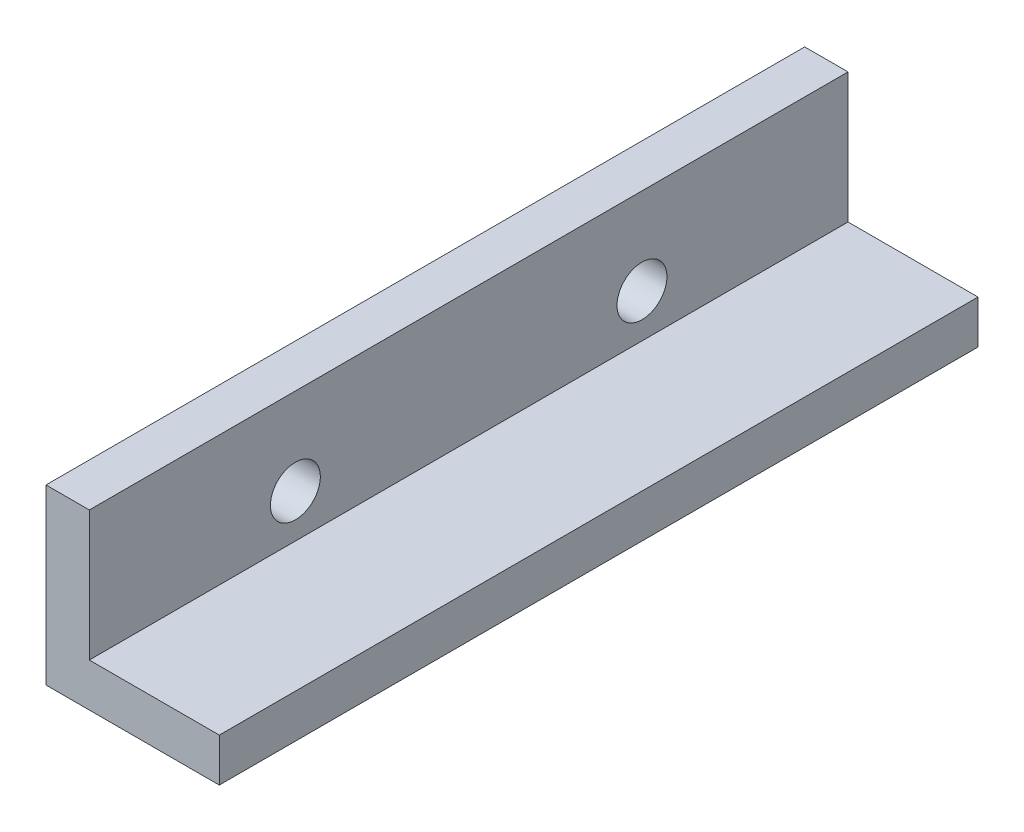
ISO-10303-21;
HEADER;
FILE_DESCRIPTION(('STEP AP214'),'2;1');
FILE_NAME('part.step','',(''),(''),'','','');
FILE_SCHEMA(('AUTOMOTIVE_DESIGN { 1 0 10303 214 1 1 1 1 }'));
ENDSEC;
DATA;
#1=APPLICATION_CONTEXT('core data for automotive mechanical design processes');
#2=APPLICATION_PROTOCOL_DEFINITION('international standard','automotive_design',2000,#1);
#3=PRODUCT_CONTEXT('',#1,'mechanical');
#4=PRODUCT('Part','Part','',(#3));
#5=PRODUCT_RELATED_PRODUCT_CATEGORY('part','',(#4));
#6=PRODUCT_DEFINITION_FORMATION('','',#4);
#7=PRODUCT_DEFINITION_CONTEXT('part definition',#1,'design');
#8=PRODUCT_DEFINITION('design','',#6,#7);
#9=PRODUCT_DEFINITION_SHAPE('','',#8);
#10=(LENGTH_UNIT() NAMED_UNIT(*) SI_UNIT(.MILLI.,.METRE.));
#11=(NAMED_UNIT(*) PLANE_ANGLE_UNIT() SI_UNIT($,.RADIAN.));
#12=(NAMED_UNIT(*) SI_UNIT($,.STERADIAN.) SOLID_ANGLE_UNIT());
#13=UNCERTAINTY_MEASURE_WITH_UNIT(LENGTH_MEASURE(1.E-05),#10,'distance_accuracy_value','');
#14=(GEOMETRIC_REPRESENTATION_CONTEXT(3) GLOBAL_UNCERTAINTY_ASSIGNED_CONTEXT((#13)) GLOBAL_UNIT_ASSIGNED_CONTEXT((#10,
#11,#12)) REPRESENTATION_CONTEXT('',''));
#15=CARTESIAN_POINT('',(0.,0.,0.));
#16=DIRECTION('',(0.,0.,1.));
#17=DIRECTION('',(1.,0.,0.));
#18=AXIS2_PLACEMENT_3D('',#15,#16,#17);
#19=CARTESIAN_POINT('',(0.,12.7,27.800000026));
#20=DIRECTION('',(0.,-1.,0.));
#21=DIRECTION('',(0.,0.,-1.));
#22=AXIS2_PLACEMENT_3D('',#19,#20,#21);
#23=PLANE('',#22);
#24=DIRECTION('',(-1.,0.,0.));
#25=VECTOR('',#24,1.);
#26=CARTESIAN_POINT('',(0.,12.7,-27.800000026));
#27=LINE('',#26,#25);
#28=CARTESIAN_POINT('',(3.175,12.7,-27.800000026));
#29=VERTEX_POINT('',#28);
#30=CARTESIAN_POINT('',(0.,12.7,-27.800000026));
#31=VERTEX_POINT('',#30);
#32=EDGE_CURVE('E121',#29,#31,#27,.T.);
#33=ORIENTED_EDGE('',*,*,#32,.T.);
#34=DIRECTION('',(0.,0.,-1.));
#35=VECTOR('',#34,1.);
#36=CARTESIAN_POINT('',(0.,12.7,27.800000026));
#37=LINE('',#36,#35);
#38=CARTESIAN_POINT('',(0.,12.7,27.800000026));
#39=VERTEX_POINT('',#38);
#40=EDGE_CURVE('E11',#39,#31,#37,.T.);
#41=ORIENTED_EDGE('',*,*,#40,.F.);
#42=DIRECTION('',(-1.,0.,0.));
#43=VECTOR('',#42,1.);
#44=CARTESIAN_POINT('',(0.,12.7,27.800000026));
#45=LINE('',#44,#43);
#46=CARTESIAN_POINT('',(3.175,12.7,27.800000026));
#47=VERTEX_POINT('',#46);
#48=EDGE_CURVE('E132',#47,#39,#45,.T.);
#49=ORIENTED_EDGE('',*,*,#48,.F.);
#50=DIRECTION('',(0.,0.,-1.));
#51=VECTOR('',#50,1.);
#52=CARTESIAN_POINT('',(3.175,12.7,27.800000026));
#53=LINE('',#52,#51);
#54=EDGE_CURVE('E117',#47,#29,#53,.T.);
#55=ORIENTED_EDGE('',*,*,#54,.T.);
#56=EDGE_LOOP('',(#33,#41,#49,#55));
#57=FACE_BOUND('',#56,.T.);
#58=ADVANCED_FACE('F35',(#57),#23,.F.);
#59=CARTESIAN_POINT('',(0.,12.7,27.800000026));
#60=DIRECTION('',(1.,0.,0.));
#61=DIRECTION('',(0.,0.,-1.));
#62=AXIS2_PLACEMENT_3D('',#59,#60,#61);
#63=PLANE('',#62);
#64=CARTESIAN_POINT('',(0.,6.35,-12.7));
#65=DIRECTION('',(-1.,0.,0.));
#66=DIRECTION('',(0.,0.,1.));
#67=AXIS2_PLACEMENT_3D('',#64,#65,#66);
#68=CIRCLE('',#67,1.8288);
#69=CARTESIAN_POINT('',(0.,6.35,-10.8712));
#70=VERTEX_POINT('',#69);
#71=EDGE_CURVE('E146',#70,#70,#68,.T.);
#72=ORIENTED_EDGE('',*,*,#71,.F.);
#73=EDGE_LOOP('',(#72));
#74=FACE_BOUND('',#73,.T.);
#75=CARTESIAN_POINT('',(0.,6.35,12.7));
#76=DIRECTION('',(-1.,0.,0.));
#77=DIRECTION('',(0.,0.,1.));
#78=AXIS2_PLACEMENT_3D('',#75,#76,#77);
#79=CIRCLE('',#78,1.8288);
#80=CARTESIAN_POINT('',(0.,6.35,14.5288));
#81=VERTEX_POINT('',#80);
#82=EDGE_CURVE('E138',#81,#81,#79,.T.);
#83=ORIENTED_EDGE('',*,*,#82,.F.);
#84=EDGE_LOOP('',(#83));
#85=FACE_BOUND('',#84,.T.);
#86=DIRECTION('',(0.,-1.,0.));
#87=VECTOR('',#86,1.);
#88=CARTESIAN_POINT('',(0.,12.7,-27.800000026));
#89=LINE('',#88,#87);
#90=CARTESIAN_POINT('',(0.,0.,-27.800000026));
#91=VERTEX_POINT('',#90);
#92=EDGE_CURVE('E124',#31,#91,#89,.T.);
#93=ORIENTED_EDGE('',*,*,#92,.T.);
#94=DIRECTION('',(0.,0.,-1.));
#95=VECTOR('',#94,1.);
#96=CARTESIAN_POINT('',(0.,0.,27.800000026));
#97=LINE('',#96,#95);
#98=CARTESIAN_POINT('',(0.,0.,27.800000026));
#99=VERTEX_POINT('',#98);
#100=EDGE_CURVE('E44',#99,#91,#97,.T.);
#101=ORIENTED_EDGE('',*,*,#100,.F.);
#102=DIRECTION('',(0.,-1.,0.));
#103=VECTOR('',#102,1.);
#104=CARTESIAN_POINT('',(0.,12.7,27.800000026));
#105=LINE('',#104,#103);
#106=EDGE_CURVE('E90',#39,#99,#105,.T.);
#107=ORIENTED_EDGE('',*,*,#106,.F.);
#108=ORIENTED_EDGE('',*,*,#40,.T.);
#109=EDGE_LOOP('',(#93,#101,#107,#108));
#110=FACE_BOUND('',#109,.T.);
#111=ADVANCED_FACE('F152',(#74,#85,#110),#63,.F.);
#112=CARTESIAN_POINT('',(0.,0.,27.800000026));
#113=DIRECTION('',(0.,1.,0.));
#114=DIRECTION('',(0.,0.,1.));
#115=AXIS2_PLACEMENT_3D('',#112,#113,#114);
#116=PLANE('',#115);
#117=DIRECTION('',(1.,0.,0.));
#118=VECTOR('',#117,1.);
#119=CARTESIAN_POINT('',(0.,0.,-27.800000026));
#120=LINE('',#119,#118);
#121=CARTESIAN_POINT('',(12.7,0.,-27.800000026));
#122=VERTEX_POINT('',#121);
#123=EDGE_CURVE('E127',#91,#122,#120,.T.);
#124=ORIENTED_EDGE('',*,*,#123,.T.);
#125=DIRECTION('',(0.,0.,-1.));
#126=VECTOR('',#125,1.);
#127=CARTESIAN_POINT('',(12.7,0.,27.800000026));
#128=LINE('',#127,#126);
#129=CARTESIAN_POINT('',(12.7,0.,27.800000026));
#130=VERTEX_POINT('',#129);
#131=EDGE_CURVE('E112',#130,#122,#128,.T.);
#132=ORIENTED_EDGE('',*,*,#131,.F.);
#133=DIRECTION('',(1.,0.,0.));
#134=VECTOR('',#133,1.);
#135=CARTESIAN_POINT('',(0.,0.,27.800000026));
#136=LINE('',#135,#134);
#137=EDGE_CURVE('E103',#99,#130,#136,.T.);
#138=ORIENTED_EDGE('',*,*,#137,.F.);
#139=ORIENTED_EDGE('',*,*,#100,.T.);
#140=EDGE_LOOP('',(#124,#132,#138,#139));
#141=FACE_BOUND('',#140,.T.);
#142=ADVANCED_FACE('F155',(#141),#116,.F.);
#143=CARTESIAN_POINT('',(12.7,3.175,27.800000026));
#144=DIRECTION('',(-1.,0.,0.));
#145=DIRECTION('',(0.,0.,1.));
#146=AXIS2_PLACEMENT_3D('',#143,#144,#145);
#147=PLANE('',#146);
#148=DIRECTION('',(0.,1.,0.));
#149=VECTOR('',#148,1.);
#150=CARTESIAN_POINT('',(12.7,3.175,-27.800000026));
#151=LINE('',#150,#149);
#152=CARTESIAN_POINT('',(12.7,3.175,-27.800000026));
#153=VERTEX_POINT('',#152);
#154=EDGE_CURVE('E111',#122,#153,#151,.T.);
#155=ORIENTED_EDGE('',*,*,#154,.T.);
#156=DIRECTION('',(0.,0.,-1.));
#157=VECTOR('',#156,1.);
#158=CARTESIAN_POINT('',(12.7,3.175,27.800000026));
#159=LINE('',#158,#157);
#160=CARTESIAN_POINT('',(12.7,3.175,27.800000026));
#161=VERTEX_POINT('',#160);
#162=EDGE_CURVE('E108',#161,#153,#159,.T.);
#163=ORIENTED_EDGE('',*,*,#162,.F.);
#164=DIRECTION('',(0.,1.,0.));
#165=VECTOR('',#164,1.);
#166=CARTESIAN_POINT('',(12.7,3.175,27.800000026));
#167=LINE('',#166,#165);
#168=EDGE_CURVE('E97',#130,#161,#167,.T.);
#169=ORIENTED_EDGE('',*,*,#168,.F.);
#170=ORIENTED_EDGE('',*,*,#131,.T.);
#171=EDGE_LOOP('',(#155,#163,#169,#170));
#172=FACE_BOUND('',#171,.T.);
#173=ADVANCED_FACE('F109',(#172),#147,.F.);
#174=CARTESIAN_POINT('',(3.175,3.175,27.800000026));
#175=DIRECTION('',(0.,-1.,0.));
#176=DIRECTION('',(0.,0.,-1.));
#177=AXIS2_PLACEMENT_3D('',#174,#175,#176);
#178=PLANE('',#177);
#179=DIRECTION('',(-1.,0.,0.));
#180=VECTOR('',#179,1.);
#181=CARTESIAN_POINT('',(3.175,3.175,-27.800000026));
#182=LINE('',#181,#180);
#183=CARTESIAN_POINT('',(3.175,3.175,-27.800000026));
#184=VERTEX_POINT('',#183);
#185=EDGE_CURVE('E76',#153,#184,#182,.T.);
#186=ORIENTED_EDGE('',*,*,#185,.T.);
#187=DIRECTION('',(0.,0.,-1.));
#188=VECTOR('',#187,1.);
#189=CARTESIAN_POINT('',(3.175,3.175,27.800000026));
#190=LINE('',#189,#188);
#191=CARTESIAN_POINT('',(3.175,3.175,27.800000026));
#192=VERTEX_POINT('',#191);
#193=EDGE_CURVE('E113',#192,#184,#190,.T.);
#194=ORIENTED_EDGE('',*,*,#193,.F.);
#195=DIRECTION('',(-1.,0.,0.));
#196=VECTOR('',#195,1.);
#197=CARTESIAN_POINT('',(3.175,3.175,27.800000026));
#198=LINE('',#197,#196);
#199=EDGE_CURVE('E101',#161,#192,#198,.T.);
#200=ORIENTED_EDGE('',*,*,#199,.F.);
#201=ORIENTED_EDGE('',*,*,#162,.T.);
#202=EDGE_LOOP('',(#186,#194,#200,#201));
#203=FACE_BOUND('',#202,.T.);
#204=ADVANCED_FACE('F115',(#203),#178,.F.);
#205=CARTESIAN_POINT('',(3.175,12.7,27.800000026));
#206=DIRECTION('',(-1.,0.,0.));
#207=DIRECTION('',(0.,-1.,0.));
#208=AXIS2_PLACEMENT_3D('',#205,#206,#207);
#209=PLANE('',#208);
#210=CARTESIAN_POINT('',(3.175,6.35,-12.7));
#211=DIRECTION('',(-1.,0.,0.));
#212=DIRECTION('',(0.,-1.,0.));
#213=AXIS2_PLACEMENT_3D('',#210,#211,#212);
#214=CIRCLE('',#213,1.8288);
#215=CARTESIAN_POINT('',(3.175,4.5212,-12.7));
#216=VERTEX_POINT('',#215);
#217=EDGE_CURVE('E38',#216,#216,#214,.T.);
#218=ORIENTED_EDGE('',*,*,#217,.T.);
#219=EDGE_LOOP('',(#218));
#220=FACE_BOUND('',#219,.T.);
#221=CARTESIAN_POINT('',(3.175,6.35,12.7));
#222=DIRECTION('',(-1.,0.,0.));
#223=DIRECTION('',(0.,-1.,0.));
#224=AXIS2_PLACEMENT_3D('',#221,#222,#223);
#225=CIRCLE('',#224,1.8288);
#226=CARTESIAN_POINT('',(3.175,4.5212,12.7));
#227=VERTEX_POINT('',#226);
#228=EDGE_CURVE('E125',#227,#227,#225,.T.);
#229=ORIENTED_EDGE('',*,*,#228,.T.);
#230=EDGE_LOOP('',(#229));
#231=FACE_BOUND('',#230,.T.);
#232=DIRECTION('',(0.,1.,0.));
#233=VECTOR('',#232,1.);
#234=CARTESIAN_POINT('',(3.175,12.7,-27.800000026));
#235=LINE('',#234,#233);
#236=EDGE_CURVE('E82',#184,#29,#235,.T.);
#237=ORIENTED_EDGE('',*,*,#236,.T.);
#238=ORIENTED_EDGE('',*,*,#54,.F.);
#239=DIRECTION('',(0.,1.,0.));
#240=VECTOR('',#239,1.);
#241=CARTESIAN_POINT('',(3.175,12.7,27.800000026));
#242=LINE('',#241,#240);
#243=EDGE_CURVE('E53',#192,#47,#242,.T.);
#244=ORIENTED_EDGE('',*,*,#243,.F.);
#245=ORIENTED_EDGE('',*,*,#193,.T.);
#246=EDGE_LOOP('',(#237,#238,#244,#245));
#247=FACE_BOUND('',#246,.T.);
#248=ADVANCED_FACE('F160',(#220,#231,#247),#209,.F.);
#249=CARTESIAN_POINT('',(0.,0.,27.800000026));
#250=DIRECTION('',(0.,0.,-1.));
#251=DIRECTION('',(-1.,0.,0.));
#252=AXIS2_PLACEMENT_3D('',#249,#250,#251);
#253=PLANE('',#252);
#254=ORIENTED_EDGE('',*,*,#48,.T.);
#255=ORIENTED_EDGE('',*,*,#106,.T.);
#256=ORIENTED_EDGE('',*,*,#137,.T.);
#257=ORIENTED_EDGE('',*,*,#168,.T.);
#258=ORIENTED_EDGE('',*,*,#199,.T.);
#259=ORIENTED_EDGE('',*,*,#243,.T.);
#260=EDGE_LOOP('',(#254,#255,#256,#257,#258,#259));
#261=FACE_BOUND('',#260,.T.);
#262=ADVANCED_FACE('F99',(#261),#253,.F.);
#263=CARTESIAN_POINT('',(0.,0.,-27.800000026));
#264=DIRECTION('',(0.,0.,-1.));
#265=DIRECTION('',(-1.,0.,0.));
#266=AXIS2_PLACEMENT_3D('',#263,#264,#265);
#267=PLANE('',#266);
#268=ORIENTED_EDGE('',*,*,#32,.F.);
#269=ORIENTED_EDGE('',*,*,#236,.F.);
#270=ORIENTED_EDGE('',*,*,#185,.F.);
#271=ORIENTED_EDGE('',*,*,#154,.F.);
#272=ORIENTED_EDGE('',*,*,#123,.F.);
#273=ORIENTED_EDGE('',*,*,#92,.F.);
#274=EDGE_LOOP('',(#268,#269,#270,#271,#272,#273));
#275=FACE_BOUND('',#274,.T.);
#276=ADVANCED_FACE('F158',(#275),#267,.T.);
#277=CARTESIAN_POINT('',(12.7,6.35,12.7));
#278=DIRECTION('',(-1.,0.,0.));
#279=DIRECTION('',(0.,0.,1.));
#280=AXIS2_PLACEMENT_3D('',#277,#278,#279);
#281=CYLINDRICAL_SURFACE('',#280,1.8288);
#282=ORIENTED_EDGE('',*,*,#82,.T.);
#283=EDGE_LOOP('',(#282));
#284=FACE_BOUND('',#283,.T.);
#285=ORIENTED_EDGE('',*,*,#228,.F.);
#286=EDGE_LOOP('',(#285));
#287=FACE_BOUND('',#286,.T.);
#288=ADVANCED_FACE('F207',(#284,#287),#281,.F.);
#289=CARTESIAN_POINT('',(12.7,6.35,-12.7));
#290=DIRECTION('',(-1.,0.,0.));
#291=DIRECTION('',(0.,0.,1.));
#292=AXIS2_PLACEMENT_3D('',#289,#290,#291);
#293=CYLINDRICAL_SURFACE('',#292,1.8288);
#294=ORIENTED_EDGE('',*,*,#71,.T.);
#295=EDGE_LOOP('',(#294));
#296=FACE_BOUND('',#295,.T.);
#297=ORIENTED_EDGE('',*,*,#217,.F.);
#298=EDGE_LOOP('',(#297));
#299=FACE_BOUND('',#298,.T.);
#300=ADVANCED_FACE('F225',(#296,#299),#293,.F.);
#301=CLOSED_SHELL('',(#58,#111,#142,#173,#204,#248,#262,#276,#288,#300));
#302=MANIFOLD_SOLID_BREP('B2',#301);
#303=ADVANCED_BREP_SHAPE_REPRESENTATION('',(#18,#302),#14);
#304=SHAPE_DEFINITION_REPRESENTATION(#9,#303);
ENDSEC;
END-ISO-10303-21;
